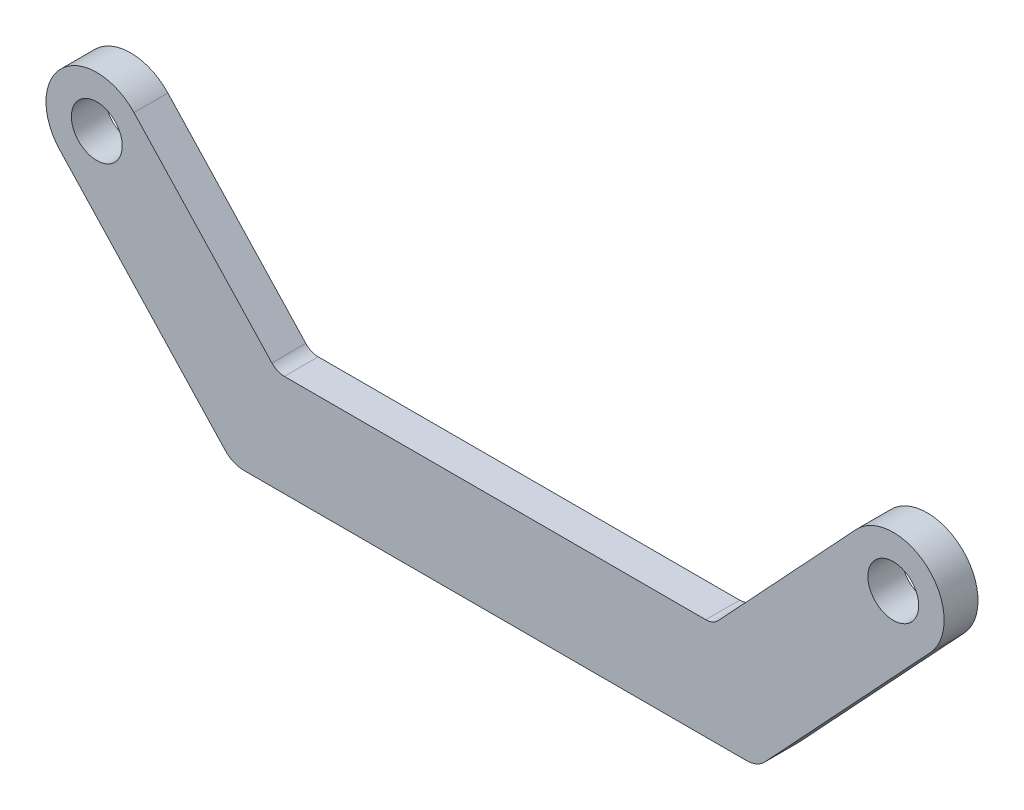
ISO-10303-21;
HEADER;
FILE_DESCRIPTION(('STEP AP214'),'2;1');
FILE_NAME('part.step','',(''),(''),'','','');
FILE_SCHEMA(('AUTOMOTIVE_DESIGN { 1 0 10303 214 1 1 1 1 }'));
ENDSEC;
DATA;
#1=APPLICATION_CONTEXT('core data for automotive mechanical design processes');
#2=APPLICATION_PROTOCOL_DEFINITION('international standard','automotive_design',2000,#1);
#3=PRODUCT_CONTEXT('',#1,'mechanical');
#4=PRODUCT('Part','Part','',(#3));
#5=PRODUCT_RELATED_PRODUCT_CATEGORY('part','',(#4));
#6=PRODUCT_DEFINITION_FORMATION('','',#4);
#7=PRODUCT_DEFINITION_CONTEXT('part definition',#1,'design');
#8=PRODUCT_DEFINITION('design','',#6,#7);
#9=PRODUCT_DEFINITION_SHAPE('','',#8);
#10=(LENGTH_UNIT() NAMED_UNIT(*) SI_UNIT(.MILLI.,.METRE.));
#11=(NAMED_UNIT(*) PLANE_ANGLE_UNIT() SI_UNIT($,.RADIAN.));
#12=(NAMED_UNIT(*) SI_UNIT($,.STERADIAN.) SOLID_ANGLE_UNIT());
#13=UNCERTAINTY_MEASURE_WITH_UNIT(LENGTH_MEASURE(1.E-05),#10,'distance_accuracy_value','');
#14=(GEOMETRIC_REPRESENTATION_CONTEXT(3) GLOBAL_UNCERTAINTY_ASSIGNED_CONTEXT((#13)) GLOBAL_UNIT_ASSIGNED_CONTEXT((#10,
#11,#12)) REPRESENTATION_CONTEXT('',''));
#15=CARTESIAN_POINT('',(0.,0.,0.));
#16=DIRECTION('',(0.,0.,1.));
#17=DIRECTION('',(1.,0.,0.));
#18=AXIS2_PLACEMENT_3D('',#15,#16,#17);
#19=CARTESIAN_POINT('',(0.,0.,4.));
#20=DIRECTION('',(0.,0.,1.));
#21=DIRECTION('',(1.,0.,0.));
#22=AXIS2_PLACEMENT_3D('',#19,#20,#21);
#23=PLANE('',#22);
#24=CARTESIAN_POINT('',(0.,0.,4.));
#25=DIRECTION('',(0.,0.,1.));
#26=DIRECTION('',(1.,0.,0.));
#27=AXIS2_PLACEMENT_3D('',#24,#25,#26);
#28=CIRCLE('',#27,3.);
#29=CARTESIAN_POINT('',(3.,0.,4.));
#30=VERTEX_POINT('',#29);
#31=EDGE_CURVE('E137',#30,#30,#28,.T.);
#32=ORIENTED_EDGE('',*,*,#31,.F.);
#33=EDGE_LOOP('',(#32));
#34=FACE_BOUND('',#33,.T.);
#35=DIRECTION('',(1.,0.,0.));
#36=VECTOR('',#35,1.);
#37=CARTESIAN_POINT('',(16.0414274729879,-26.,4.));
#38=LINE('',#37,#36);
#39=CARTESIAN_POINT('',(17.3458645978706,-26.,4.));
#40=VERTEX_POINT('',#39);
#41=CARTESIAN_POINT('',(76.6541354021296,-26.,4.));
#42=VERTEX_POINT('',#41);
#43=EDGE_CURVE('E192',#40,#42,#38,.T.);
#44=ORIENTED_EDGE('',*,*,#43,.T.);
#45=CARTESIAN_POINT('',(76.6541354021297,-23.,4.));
#46=DIRECTION('',(0.,0.,1.));
#47=DIRECTION('',(1.,0.,0.));
#48=AXIS2_PLACEMENT_3D('',#45,#46,#47);
#49=CIRCLE('',#48,3.);
#50=CARTESIAN_POINT('',(78.8481965069872,-25.0459950801875,4.));
#51=VERTEX_POINT('',#50);
#52=EDGE_CURVE('E43',#42,#51,#49,.T.);
#53=ORIENTED_EDGE('',*,*,#52,.T.);
#54=DIRECTION('',(0.681998360062497,0.731353701619172,0.));
#55=VECTOR('',#54,1.);
#56=CARTESIAN_POINT('',(77.9585725270125,-26.,4.));
#57=LINE('',#56,#55);
#58=CARTESIAN_POINT('',(98.388122209715,-4.09199016037498,4.));
#59=VERTEX_POINT('',#58);
#60=EDGE_CURVE('E190',#51,#59,#57,.T.);
#61=ORIENTED_EDGE('',*,*,#60,.T.);
#62=CARTESIAN_POINT('',(94.,0.,4.));
#63=DIRECTION('',(0.,0.,1.));
#64=DIRECTION('',(1.,0.,0.));
#65=AXIS2_PLACEMENT_3D('',#62,#63,#64);
#66=CIRCLE('',#65,6.);
#67=CARTESIAN_POINT('',(89.611877790285,4.09199016037498,4.));
#68=VERTEX_POINT('',#67);
#69=EDGE_CURVE('E199',#59,#68,#66,.T.);
#70=ORIENTED_EDGE('',*,*,#69,.T.);
#71=DIRECTION('',(-0.681998360062497,-0.731353701619172,0.));
#72=VECTOR('',#71,1.);
#73=CARTESIAN_POINT('',(72.7408240274812,-14.,4.));
#74=LINE('',#73,#72);
#75=CARTESIAN_POINT('',(73.3339066807977,-13.363996720125,4.));
#76=VERTEX_POINT('',#75);
#77=EDGE_CURVE('E226',#68,#76,#74,.T.);
#78=ORIENTED_EDGE('',*,*,#77,.T.);
#79=CARTESIAN_POINT('',(71.8711992775594,-12.,4.));
#80=DIRECTION('',(0.,0.,1.));
#81=DIRECTION('',(1.,0.,0.));
#82=AXIS2_PLACEMENT_3D('',#79,#80,#81);
#83=CIRCLE('',#82,2.);
#84=CARTESIAN_POINT('',(71.8711992775594,-14.,4.));
#85=VERTEX_POINT('',#84);
#86=EDGE_CURVE('E172',#76,#85,#83,.F.);
#87=ORIENTED_EDGE('',*,*,#86,.T.);
#88=DIRECTION('',(-1.,0.,0.));
#89=VECTOR('',#88,1.);
#90=CARTESIAN_POINT('',(21.259175972519,-14.,4.));
#91=LINE('',#90,#89);
#92=CARTESIAN_POINT('',(22.1288007224409,-14.,4.));
#93=VERTEX_POINT('',#92);
#94=EDGE_CURVE('E229',#85,#93,#91,.T.);
#95=ORIENTED_EDGE('',*,*,#94,.T.);
#96=CARTESIAN_POINT('',(22.1288007224409,-12.,4.));
#97=DIRECTION('',(0.,0.,1.));
#98=DIRECTION('',(1.,0.,0.));
#99=AXIS2_PLACEMENT_3D('',#96,#97,#98);
#100=CIRCLE('',#99,2.);
#101=CARTESIAN_POINT('',(20.6660933192025,-13.363996720125,4.));
#102=VERTEX_POINT('',#101);
#103=EDGE_CURVE('E163',#93,#102,#100,.F.);
#104=ORIENTED_EDGE('',*,*,#103,.T.);
#105=DIRECTION('',(-0.681998360062503,0.731353701619167,0.));
#106=VECTOR('',#105,1.);
#107=CARTESIAN_POINT('',(21.259175972519,-14.,4.));
#108=LINE('',#107,#106);
#109=CARTESIAN_POINT('',(4.38812220971503,4.09199016037498,4.));
#110=VERTEX_POINT('',#109);
#111=EDGE_CURVE('E219',#102,#110,#108,.T.);
#112=ORIENTED_EDGE('',*,*,#111,.T.);
#113=CARTESIAN_POINT('',(0.,0.,4.));
#114=DIRECTION('',(0.,0.,1.));
#115=DIRECTION('',(1.,0.,0.));
#116=AXIS2_PLACEMENT_3D('',#113,#114,#115);
#117=CIRCLE('',#116,6.);
#118=CARTESIAN_POINT('',(-4.388122209715,-4.09199016037501,4.));
#119=VERTEX_POINT('',#118);
#120=EDGE_CURVE('E150',#110,#119,#117,.T.);
#121=ORIENTED_EDGE('',*,*,#120,.T.);
#122=DIRECTION('',(0.681998360062502,-0.731353701619167,0.));
#123=VECTOR('',#122,1.);
#124=CARTESIAN_POINT('',(16.0414274729879,-26.,4.));
#125=LINE('',#124,#123);
#126=CARTESIAN_POINT('',(15.1518034930131,-25.0459950801875,4.));
#127=VERTEX_POINT('',#126);
#128=EDGE_CURVE('E222',#119,#127,#125,.T.);
#129=ORIENTED_EDGE('',*,*,#128,.T.);
#130=CARTESIAN_POINT('',(17.3458645978706,-23.,4.));
#131=DIRECTION('',(0.,0.,1.));
#132=DIRECTION('',(1.,0.,0.));
#133=AXIS2_PLACEMENT_3D('',#130,#131,#132);
#134=CIRCLE('',#133,3.);
#135=EDGE_CURVE('E185',#127,#40,#134,.T.);
#136=ORIENTED_EDGE('',*,*,#135,.T.);
#137=EDGE_LOOP('',(#44,#53,#61,#70,#78,#87,#95,#104,#112,#121,#129,#136));
#138=FACE_BOUND('',#137,.T.);
#139=CARTESIAN_POINT('',(94.,0.,4.));
#140=DIRECTION('',(0.,0.,1.));
#141=DIRECTION('',(1.,0.,0.));
#142=AXIS2_PLACEMENT_3D('',#139,#140,#141);
#143=CIRCLE('',#142,3.00000000000001);
#144=CARTESIAN_POINT('',(97.,0.,4.));
#145=VERTEX_POINT('',#144);
#146=EDGE_CURVE('E419',#145,#145,#143,.T.);
#147=ORIENTED_EDGE('',*,*,#146,.F.);
#148=EDGE_LOOP('',(#147));
#149=FACE_BOUND('',#148,.T.);
#150=ADVANCED_FACE('F35',(#34,#138,#149),#23,.T.);
#151=CARTESIAN_POINT('',(0.,0.,0.));
#152=DIRECTION('',(0.,0.,1.));
#153=DIRECTION('',(1.,0.,0.));
#154=AXIS2_PLACEMENT_3D('',#151,#152,#153);
#155=PLANE('',#154);
#156=CARTESIAN_POINT('',(0.,0.,0.));
#157=DIRECTION('',(0.,0.,1.));
#158=DIRECTION('',(1.,0.,0.));
#159=AXIS2_PLACEMENT_3D('',#156,#157,#158);
#160=CIRCLE('',#159,3.);
#161=CARTESIAN_POINT('',(3.,0.,0.));
#162=VERTEX_POINT('',#161);
#163=EDGE_CURVE('E424',#162,#162,#160,.T.);
#164=ORIENTED_EDGE('',*,*,#163,.T.);
#165=EDGE_LOOP('',(#164));
#166=FACE_BOUND('',#165,.T.);
#167=DIRECTION('',(0.681998360062497,0.731353701619172,0.));
#168=VECTOR('',#167,1.);
#169=CARTESIAN_POINT('',(77.9585725270125,-26.,0.));
#170=LINE('',#169,#168);
#171=CARTESIAN_POINT('',(78.8481965069872,-25.0459950801875,0.));
#172=VERTEX_POINT('',#171);
#173=CARTESIAN_POINT('',(98.388122209715,-4.09199016037498,0.));
#174=VERTEX_POINT('',#173);
#175=EDGE_CURVE('E205',#172,#174,#170,.T.);
#176=ORIENTED_EDGE('',*,*,#175,.F.);
#177=CARTESIAN_POINT('',(76.6541354021297,-23.,0.));
#178=DIRECTION('',(0.,0.,1.));
#179=DIRECTION('',(1.,0.,0.));
#180=AXIS2_PLACEMENT_3D('',#177,#178,#179);
#181=CIRCLE('',#180,3.);
#182=CARTESIAN_POINT('',(76.6541354021296,-26.,0.));
#183=VERTEX_POINT('',#182);
#184=EDGE_CURVE('E179',#172,#183,#181,.F.);
#185=ORIENTED_EDGE('',*,*,#184,.T.);
#186=DIRECTION('',(1.,0.,0.));
#187=VECTOR('',#186,1.);
#188=CARTESIAN_POINT('',(16.0414274729879,-26.,0.));
#189=LINE('',#188,#187);
#190=CARTESIAN_POINT('',(17.3458645978706,-26.,0.));
#191=VERTEX_POINT('',#190);
#192=EDGE_CURVE('E203',#191,#183,#189,.T.);
#193=ORIENTED_EDGE('',*,*,#192,.F.);
#194=CARTESIAN_POINT('',(17.3458645978706,-23.,0.));
#195=DIRECTION('',(0.,0.,1.));
#196=DIRECTION('',(1.,0.,0.));
#197=AXIS2_PLACEMENT_3D('',#194,#195,#196);
#198=CIRCLE('',#197,3.);
#199=CARTESIAN_POINT('',(15.1518034930131,-25.0459950801875,0.));
#200=VERTEX_POINT('',#199);
#201=EDGE_CURVE('E177',#191,#200,#198,.F.);
#202=ORIENTED_EDGE('',*,*,#201,.T.);
#203=DIRECTION('',(0.681998360062502,-0.731353701619167,0.));
#204=VECTOR('',#203,1.);
#205=CARTESIAN_POINT('',(16.0414274729879,-26.,0.));
#206=LINE('',#205,#204);
#207=CARTESIAN_POINT('',(-4.388122209715,-4.09199016037501,0.));
#208=VERTEX_POINT('',#207);
#209=EDGE_CURVE('E143',#208,#200,#206,.T.);
#210=ORIENTED_EDGE('',*,*,#209,.F.);
#211=CARTESIAN_POINT('',(0.,0.,0.));
#212=DIRECTION('',(0.,0.,1.));
#213=DIRECTION('',(1.,0.,0.));
#214=AXIS2_PLACEMENT_3D('',#211,#212,#213);
#215=CIRCLE('',#214,6.);
#216=CARTESIAN_POINT('',(4.38812220971503,4.09199016037498,0.));
#217=VERTEX_POINT('',#216);
#218=EDGE_CURVE('E136',#217,#208,#215,.T.);
#219=ORIENTED_EDGE('',*,*,#218,.F.);
#220=DIRECTION('',(-0.681998360062503,0.731353701619167,0.));
#221=VECTOR('',#220,1.);
#222=CARTESIAN_POINT('',(21.259175972519,-14.,0.));
#223=LINE('',#222,#221);
#224=CARTESIAN_POINT('',(20.6660933192025,-13.363996720125,0.));
#225=VERTEX_POINT('',#224);
#226=EDGE_CURVE('E127',#225,#217,#223,.T.);
#227=ORIENTED_EDGE('',*,*,#226,.F.);
#228=CARTESIAN_POINT('',(22.1288007224409,-12.,0.));
#229=DIRECTION('',(0.,0.,1.));
#230=DIRECTION('',(1.,0.,0.));
#231=AXIS2_PLACEMENT_3D('',#228,#229,#230);
#232=CIRCLE('',#231,2.);
#233=CARTESIAN_POINT('',(22.1288007224409,-14.,0.));
#234=VERTEX_POINT('',#233);
#235=EDGE_CURVE('E161',#225,#234,#232,.T.);
#236=ORIENTED_EDGE('',*,*,#235,.T.);
#237=DIRECTION('',(-1.,0.,0.));
#238=VECTOR('',#237,1.);
#239=CARTESIAN_POINT('',(21.259175972519,-14.,0.));
#240=LINE('',#239,#238);
#241=CARTESIAN_POINT('',(71.8711992775594,-14.,0.));
#242=VERTEX_POINT('',#241);
#243=EDGE_CURVE('E217',#242,#234,#240,.T.);
#244=ORIENTED_EDGE('',*,*,#243,.F.);
#245=CARTESIAN_POINT('',(71.8711992775594,-12.,0.));
#246=DIRECTION('',(0.,0.,1.));
#247=DIRECTION('',(1.,0.,0.));
#248=AXIS2_PLACEMENT_3D('',#245,#246,#247);
#249=CIRCLE('',#248,2.);
#250=CARTESIAN_POINT('',(73.3339066807977,-13.363996720125,0.));
#251=VERTEX_POINT('',#250);
#252=EDGE_CURVE('E170',#242,#251,#249,.T.);
#253=ORIENTED_EDGE('',*,*,#252,.T.);
#254=DIRECTION('',(-0.681998360062497,-0.731353701619172,0.));
#255=VECTOR('',#254,1.);
#256=CARTESIAN_POINT('',(72.7408240274812,-14.,0.));
#257=LINE('',#256,#255);
#258=CARTESIAN_POINT('',(89.611877790285,4.09199016037498,0.));
#259=VERTEX_POINT('',#258);
#260=EDGE_CURVE('E214',#259,#251,#257,.T.);
#261=ORIENTED_EDGE('',*,*,#260,.F.);
#262=CARTESIAN_POINT('',(94.,0.,0.));
#263=DIRECTION('',(0.,0.,1.));
#264=DIRECTION('',(1.,0.,0.));
#265=AXIS2_PLACEMENT_3D('',#262,#263,#264);
#266=CIRCLE('',#265,6.);
#267=EDGE_CURVE('E209',#174,#259,#266,.T.);
#268=ORIENTED_EDGE('',*,*,#267,.F.);
#269=EDGE_LOOP('',(#176,#185,#193,#202,#210,#219,#227,#236,#244,#253,#261,#268));
#270=FACE_BOUND('',#269,.T.);
#271=CARTESIAN_POINT('',(94.,0.,0.));
#272=DIRECTION('',(0.,0.,1.));
#273=DIRECTION('',(1.,0.,0.));
#274=AXIS2_PLACEMENT_3D('',#271,#272,#273);
#275=CIRCLE('',#274,3.00000000000001);
#276=CARTESIAN_POINT('',(97.,0.,0.));
#277=VERTEX_POINT('',#276);
#278=EDGE_CURVE('E422',#277,#277,#275,.T.);
#279=ORIENTED_EDGE('',*,*,#278,.T.);
#280=EDGE_LOOP('',(#279));
#281=FACE_BOUND('',#280,.T.);
#282=ADVANCED_FACE('F141',(#166,#270,#281),#155,.F.);
#283=CARTESIAN_POINT('',(21.259175972519,-14.,4.));
#284=DIRECTION('',(-0.731353701619167,-0.681998360062503,0.));
#285=DIRECTION('',(0.681998360062503,-0.731353701619167,0.));
#286=AXIS2_PLACEMENT_3D('',#283,#284,#285);
#287=PLANE('',#286);
#288=ORIENTED_EDGE('',*,*,#111,.F.);
#289=DIRECTION('',(0.,0.,-1.));
#290=VECTOR('',#289,1.);
#291=CARTESIAN_POINT('',(20.6660933192025,-13.363996720125,0.));
#292=LINE('',#291,#290);
#293=EDGE_CURVE('E133',#102,#225,#292,.T.);
#294=ORIENTED_EDGE('',*,*,#293,.T.);
#295=ORIENTED_EDGE('',*,*,#226,.T.);
#296=DIRECTION('',(0.,0.,-1.));
#297=VECTOR('',#296,1.);
#298=CARTESIAN_POINT('',(4.38812220971503,4.09199016037498,4.));
#299=LINE('',#298,#297);
#300=EDGE_CURVE('E131',#110,#217,#299,.T.);
#301=ORIENTED_EDGE('',*,*,#300,.F.);
#302=EDGE_LOOP('',(#288,#294,#295,#301));
#303=FACE_BOUND('',#302,.T.);
#304=ADVANCED_FACE('F37',(#303),#287,.F.);
#305=CARTESIAN_POINT('',(0.,0.,4.));
#306=DIRECTION('',(0.,0.,-1.));
#307=DIRECTION('',(-1.,0.,0.));
#308=AXIS2_PLACEMENT_3D('',#305,#306,#307);
#309=CYLINDRICAL_SURFACE('',#308,6.);
#310=ORIENTED_EDGE('',*,*,#218,.T.);
#311=DIRECTION('',(0.,0.,-1.));
#312=VECTOR('',#311,1.);
#313=CARTESIAN_POINT('',(-4.388122209715,-4.09199016037501,4.));
#314=LINE('',#313,#312);
#315=EDGE_CURVE('E151',#119,#208,#314,.T.);
#316=ORIENTED_EDGE('',*,*,#315,.F.);
#317=ORIENTED_EDGE('',*,*,#120,.F.);
#318=ORIENTED_EDGE('',*,*,#300,.T.);
#319=EDGE_LOOP('',(#310,#316,#317,#318));
#320=FACE_BOUND('',#319,.T.);
#321=ADVANCED_FACE('F149',(#320),#309,.T.);
#322=CARTESIAN_POINT('',(16.0414274729879,-26.,4.));
#323=DIRECTION('',(0.731353701619167,0.681998360062502,0.));
#324=DIRECTION('',(-0.681998360062502,0.731353701619167,0.));
#325=AXIS2_PLACEMENT_3D('',#322,#323,#324);
#326=PLANE('',#325);
#327=ORIENTED_EDGE('',*,*,#209,.T.);
#328=DIRECTION('',(0.,0.,-1.));
#329=VECTOR('',#328,1.);
#330=CARTESIAN_POINT('',(15.1518034930131,-25.0459950801875,4.));
#331=LINE('',#330,#329);
#332=EDGE_CURVE('E11',#200,#127,#331,.F.);
#333=ORIENTED_EDGE('',*,*,#332,.T.);
#334=ORIENTED_EDGE('',*,*,#128,.F.);
#335=ORIENTED_EDGE('',*,*,#315,.T.);
#336=EDGE_LOOP('',(#327,#333,#334,#335));
#337=FACE_BOUND('',#336,.T.);
#338=ADVANCED_FACE('F254',(#337),#326,.F.);
#339=CARTESIAN_POINT('',(16.0414274729879,-26.,4.));
#340=DIRECTION('',(0.,1.,0.));
#341=DIRECTION('',(0.,0.,1.));
#342=AXIS2_PLACEMENT_3D('',#339,#340,#341);
#343=PLANE('',#342);
#344=ORIENTED_EDGE('',*,*,#192,.T.);
#345=DIRECTION('',(0.,0.,-1.));
#346=VECTOR('',#345,1.);
#347=CARTESIAN_POINT('',(76.6541354021297,-26.,4.));
#348=LINE('',#347,#346);
#349=EDGE_CURVE('E56',#183,#42,#348,.F.);
#350=ORIENTED_EDGE('',*,*,#349,.T.);
#351=ORIENTED_EDGE('',*,*,#43,.F.);
#352=DIRECTION('',(0.,0.,-1.));
#353=VECTOR('',#352,1.);
#354=CARTESIAN_POINT('',(17.3458645978706,-26.,4.));
#355=LINE('',#354,#353);
#356=EDGE_CURVE('E181',#40,#191,#355,.T.);
#357=ORIENTED_EDGE('',*,*,#356,.T.);
#358=EDGE_LOOP('',(#344,#350,#351,#357));
#359=FACE_BOUND('',#358,.T.);
#360=ADVANCED_FACE('F206',(#359),#343,.F.);
#361=CARTESIAN_POINT('',(77.9585725270125,-26.,4.));
#362=DIRECTION('',(-0.731353701619172,0.681998360062497,0.));
#363=DIRECTION('',(-0.681998360062497,-0.731353701619172,0.));
#364=AXIS2_PLACEMENT_3D('',#361,#362,#363);
#365=PLANE('',#364);
#366=ORIENTED_EDGE('',*,*,#60,.F.);
#367=DIRECTION('',(0.,0.,-1.));
#368=VECTOR('',#367,1.);
#369=CARTESIAN_POINT('',(78.8481965069872,-25.0459950801875,4.));
#370=LINE('',#369,#368);
#371=EDGE_CURVE('E174',#51,#172,#370,.T.);
#372=ORIENTED_EDGE('',*,*,#371,.T.);
#373=ORIENTED_EDGE('',*,*,#175,.T.);
#374=DIRECTION('',(0.,0.,-1.));
#375=VECTOR('',#374,1.);
#376=CARTESIAN_POINT('',(98.388122209715,-4.09199016037498,4.));
#377=LINE('',#376,#375);
#378=EDGE_CURVE('E155',#59,#174,#377,.T.);
#379=ORIENTED_EDGE('',*,*,#378,.F.);
#380=EDGE_LOOP('',(#366,#372,#373,#379));
#381=FACE_BOUND('',#380,.T.);
#382=ADVANCED_FACE('F196',(#381),#365,.F.);
#383=CARTESIAN_POINT('',(94.,0.,4.));
#384=DIRECTION('',(0.,0.,-1.));
#385=DIRECTION('',(-1.,0.,0.));
#386=AXIS2_PLACEMENT_3D('',#383,#384,#385);
#387=CYLINDRICAL_SURFACE('',#386,6.);
#388=ORIENTED_EDGE('',*,*,#267,.T.);
#389=DIRECTION('',(0.,0.,-1.));
#390=VECTOR('',#389,1.);
#391=CARTESIAN_POINT('',(89.611877790285,4.09199016037498,4.));
#392=LINE('',#391,#390);
#393=EDGE_CURVE('E231',#68,#259,#392,.T.);
#394=ORIENTED_EDGE('',*,*,#393,.F.);
#395=ORIENTED_EDGE('',*,*,#69,.F.);
#396=ORIENTED_EDGE('',*,*,#378,.T.);
#397=EDGE_LOOP('',(#388,#394,#395,#396));
#398=FACE_BOUND('',#397,.T.);
#399=ADVANCED_FACE('F234',(#398),#387,.T.);
#400=CARTESIAN_POINT('',(72.7408240274812,-14.,4.));
#401=DIRECTION('',(0.731353701619172,-0.681998360062497,0.));
#402=DIRECTION('',(0.681998360062497,0.731353701619172,0.));
#403=AXIS2_PLACEMENT_3D('',#400,#401,#402);
#404=PLANE('',#403);
#405=ORIENTED_EDGE('',*,*,#260,.T.);
#406=DIRECTION('',(0.,0.,-1.));
#407=VECTOR('',#406,1.);
#408=CARTESIAN_POINT('',(73.3339066807977,-13.363996720125,4.));
#409=LINE('',#408,#407);
#410=EDGE_CURVE('E168',#251,#76,#409,.F.);
#411=ORIENTED_EDGE('',*,*,#410,.T.);
#412=ORIENTED_EDGE('',*,*,#77,.F.);
#413=ORIENTED_EDGE('',*,*,#393,.T.);
#414=EDGE_LOOP('',(#405,#411,#412,#413));
#415=FACE_BOUND('',#414,.T.);
#416=ADVANCED_FACE('F240',(#415),#404,.F.);
#417=CARTESIAN_POINT('',(21.259175972519,-14.,4.));
#418=DIRECTION('',(0.,-1.,0.));
#419=DIRECTION('',(0.,0.,-1.));
#420=AXIS2_PLACEMENT_3D('',#417,#418,#419);
#421=PLANE('',#420);
#422=ORIENTED_EDGE('',*,*,#94,.F.);
#423=DIRECTION('',(0.,0.,-1.));
#424=VECTOR('',#423,1.);
#425=CARTESIAN_POINT('',(71.8711992775594,-14.,0.));
#426=LINE('',#425,#424);
#427=EDGE_CURVE('E165',#85,#242,#426,.T.);
#428=ORIENTED_EDGE('',*,*,#427,.T.);
#429=ORIENTED_EDGE('',*,*,#243,.T.);
#430=DIRECTION('',(0.,0.,-1.));
#431=VECTOR('',#430,1.);
#432=CARTESIAN_POINT('',(22.1288007224409,-14.,4.));
#433=LINE('',#432,#431);
#434=EDGE_CURVE('E153',#234,#93,#433,.F.);
#435=ORIENTED_EDGE('',*,*,#434,.T.);
#436=EDGE_LOOP('',(#422,#428,#429,#435));
#437=FACE_BOUND('',#436,.T.);
#438=ADVANCED_FACE('F248',(#437),#421,.F.);
#439=CARTESIAN_POINT('',(0.,0.,4.));
#440=DIRECTION('',(0.,0.,-1.));
#441=DIRECTION('',(-1.,0.,0.));
#442=AXIS2_PLACEMENT_3D('',#439,#440,#441);
#443=CYLINDRICAL_SURFACE('',#442,3.);
#444=ORIENTED_EDGE('',*,*,#31,.T.);
#445=EDGE_LOOP('',(#444));
#446=FACE_BOUND('',#445,.T.);
#447=ORIENTED_EDGE('',*,*,#163,.F.);
#448=EDGE_LOOP('',(#447));
#449=FACE_BOUND('',#448,.T.);
#450=ADVANCED_FACE('F275',(#446,#449),#443,.F.);
#451=CARTESIAN_POINT('',(94.,0.,4.));
#452=DIRECTION('',(0.,0.,-1.));
#453=DIRECTION('',(-1.,0.,0.));
#454=AXIS2_PLACEMENT_3D('',#451,#452,#453);
#455=CYLINDRICAL_SURFACE('',#454,3.00000000000001);
#456=ORIENTED_EDGE('',*,*,#146,.T.);
#457=EDGE_LOOP('',(#456));
#458=FACE_BOUND('',#457,.T.);
#459=ORIENTED_EDGE('',*,*,#278,.F.);
#460=EDGE_LOOP('',(#459));
#461=FACE_BOUND('',#460,.T.);
#462=ADVANCED_FACE('F304',(#458,#461),#455,.F.);
#463=CARTESIAN_POINT('',(22.1288007224409,-12.,4.));
#464=DIRECTION('',(0.,0.,1.));
#465=DIRECTION('',(1.,0.,0.));
#466=AXIS2_PLACEMENT_3D('',#463,#464,#465);
#467=CYLINDRICAL_SURFACE('',#466,2.);
#468=ORIENTED_EDGE('',*,*,#103,.F.);
#469=ORIENTED_EDGE('',*,*,#434,.F.);
#470=ORIENTED_EDGE('',*,*,#235,.F.);
#471=ORIENTED_EDGE('',*,*,#293,.F.);
#472=EDGE_LOOP('',(#468,#469,#470,#471));
#473=FACE_BOUND('',#472,.T.);
#474=ADVANCED_FACE('F252',(#473),#467,.F.);
#475=CARTESIAN_POINT('',(71.8711992775594,-12.,4.));
#476=DIRECTION('',(0.,0.,1.));
#477=DIRECTION('',(1.,0.,0.));
#478=AXIS2_PLACEMENT_3D('',#475,#476,#477);
#479=CYLINDRICAL_SURFACE('',#478,2.);
#480=ORIENTED_EDGE('',*,*,#86,.F.);
#481=ORIENTED_EDGE('',*,*,#410,.F.);
#482=ORIENTED_EDGE('',*,*,#252,.F.);
#483=ORIENTED_EDGE('',*,*,#427,.F.);
#484=EDGE_LOOP('',(#480,#481,#482,#483));
#485=FACE_BOUND('',#484,.T.);
#486=ADVANCED_FACE('F244',(#485),#479,.F.);
#487=CARTESIAN_POINT('',(76.6541354021297,-23.,4.));
#488=DIRECTION('',(0.,0.,-1.));
#489=DIRECTION('',(-1.,0.,0.));
#490=AXIS2_PLACEMENT_3D('',#487,#488,#489);
#491=CYLINDRICAL_SURFACE('',#490,3.);
#492=ORIENTED_EDGE('',*,*,#52,.F.);
#493=ORIENTED_EDGE('',*,*,#349,.F.);
#494=ORIENTED_EDGE('',*,*,#184,.F.);
#495=ORIENTED_EDGE('',*,*,#371,.F.);
#496=EDGE_LOOP('',(#492,#493,#494,#495));
#497=FACE_BOUND('',#496,.T.);
#498=ADVANCED_FACE('F201',(#497),#491,.T.);
#499=CARTESIAN_POINT('',(17.3458645978706,-23.,4.));
#500=DIRECTION('',(0.,0.,-1.));
#501=DIRECTION('',(-1.,0.,0.));
#502=AXIS2_PLACEMENT_3D('',#499,#500,#501);
#503=CYLINDRICAL_SURFACE('',#502,3.);
#504=ORIENTED_EDGE('',*,*,#135,.F.);
#505=ORIENTED_EDGE('',*,*,#332,.F.);
#506=ORIENTED_EDGE('',*,*,#201,.F.);
#507=ORIENTED_EDGE('',*,*,#356,.F.);
#508=EDGE_LOOP('',(#504,#505,#506,#507));
#509=FACE_BOUND('',#508,.T.);
#510=ADVANCED_FACE('F332',(#509),#503,.T.);
#511=CLOSED_SHELL('',(#150,#282,#304,#321,#338,#360,#382,#399,#416,#438,#450,#462,#474,#486,
#498,#510));
#512=MANIFOLD_SOLID_BREP('B2',#511);
#513=ADVANCED_BREP_SHAPE_REPRESENTATION('',(#18,#512),#14);
#514=SHAPE_DEFINITION_REPRESENTATION(#9,#513);
ENDSEC;
END-ISO-10303-21;
